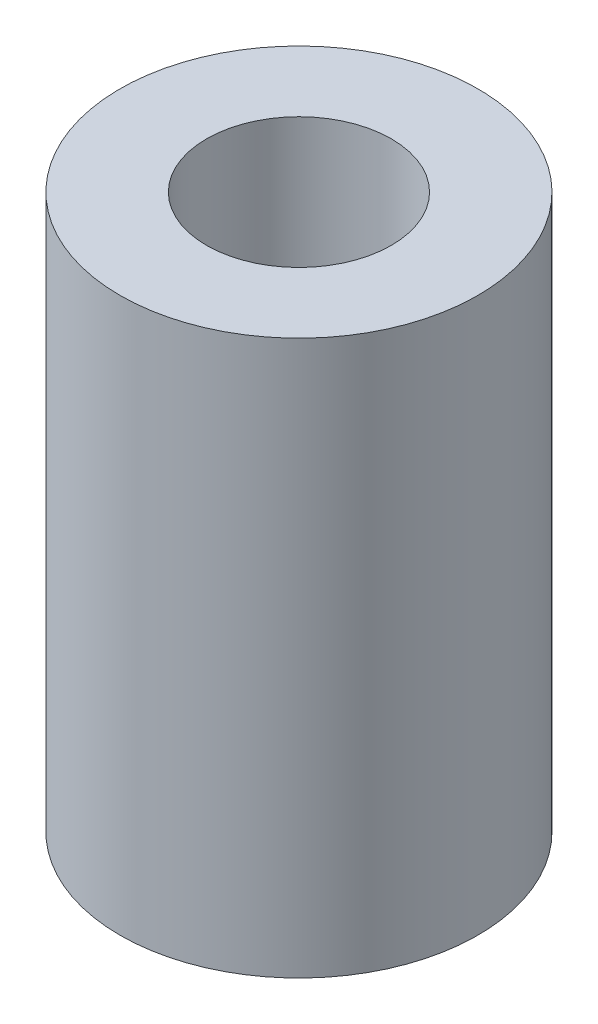
ISO-10303-21;
HEADER;
FILE_DESCRIPTION(('STEP AP214'),'2;1');
FILE_NAME('part.step','',(''),(''),'','','');
FILE_SCHEMA(('AUTOMOTIVE_DESIGN { 1 0 10303 214 1 1 1 1 }'));
ENDSEC;
DATA;
#1=APPLICATION_CONTEXT('core data for automotive mechanical design processes');
#2=APPLICATION_PROTOCOL_DEFINITION('international standard','automotive_design',2000,#1);
#3=PRODUCT_CONTEXT('',#1,'mechanical');
#4=PRODUCT('Part','Part','',(#3));
#5=PRODUCT_RELATED_PRODUCT_CATEGORY('part','',(#4));
#6=PRODUCT_DEFINITION_FORMATION('','',#4);
#7=PRODUCT_DEFINITION_CONTEXT('part definition',#1,'design');
#8=PRODUCT_DEFINITION('design','',#6,#7);
#9=PRODUCT_DEFINITION_SHAPE('','',#8);
#10=(LENGTH_UNIT() NAMED_UNIT(*) SI_UNIT(.MILLI.,.METRE.));
#11=(NAMED_UNIT(*) PLANE_ANGLE_UNIT() SI_UNIT($,.RADIAN.));
#12=(NAMED_UNIT(*) SI_UNIT($,.STERADIAN.) SOLID_ANGLE_UNIT());
#13=UNCERTAINTY_MEASURE_WITH_UNIT(LENGTH_MEASURE(1.E-05),#10,'distance_accuracy_value','');
#14=(GEOMETRIC_REPRESENTATION_CONTEXT(3) GLOBAL_UNCERTAINTY_ASSIGNED_CONTEXT((#13)) GLOBAL_UNIT_ASSIGNED_CONTEXT((#10,
#11,#12)) REPRESENTATION_CONTEXT('',''));
#15=CARTESIAN_POINT('',(0.,0.,0.));
#16=DIRECTION('',(0.,0.,1.));
#17=DIRECTION('',(1.,0.,0.));
#18=AXIS2_PLACEMENT_3D('',#15,#16,#17);
#19=CARTESIAN_POINT('',(0.,24.,0.));
#20=DIRECTION('',(0.,1.,0.));
#21=DIRECTION('',(0.,0.,1.));
#22=AXIS2_PLACEMENT_3D('',#19,#20,#21);
#23=PLANE('',#22);
#24=CARTESIAN_POINT('',(0.,24.,0.));
#25=DIRECTION('',(0.,1.,0.));
#26=DIRECTION('',(0.,0.,1.));
#27=AXIS2_PLACEMENT_3D('',#24,#25,#26);
#28=CIRCLE('',#27,7.75);
#29=CARTESIAN_POINT('',(0.,24.,7.75));
#30=VERTEX_POINT('',#29);
#31=EDGE_CURVE('E10',#30,#30,#28,.T.);
#32=ORIENTED_EDGE('',*,*,#31,.T.);
#33=EDGE_LOOP('',(#32));
#34=FACE_BOUND('',#33,.T.);
#35=CARTESIAN_POINT('',(0.,24.,0.));
#36=DIRECTION('',(0.,1.,0.));
#37=DIRECTION('',(0.,0.,1.));
#38=AXIS2_PLACEMENT_3D('',#35,#36,#37);
#39=CIRCLE('',#38,4.);
#40=CARTESIAN_POINT('',(0.,24.,4.));
#41=VERTEX_POINT('',#40);
#42=EDGE_CURVE('E54',#41,#41,#39,.T.);
#43=ORIENTED_EDGE('',*,*,#42,.F.);
#44=EDGE_LOOP('',(#43));
#45=FACE_BOUND('',#44,.T.);
#46=ADVANCED_FACE('F41',(#34,#45),#23,.T.);
#47=CARTESIAN_POINT('',(0.,0.,0.));
#48=DIRECTION('',(0.,1.,0.));
#49=DIRECTION('',(0.,0.,1.));
#50=AXIS2_PLACEMENT_3D('',#47,#48,#49);
#51=PLANE('',#50);
#52=CARTESIAN_POINT('',(0.,0.,0.));
#53=DIRECTION('',(0.,1.,0.));
#54=DIRECTION('',(0.,0.,1.));
#55=AXIS2_PLACEMENT_3D('',#52,#53,#54);
#56=CIRCLE('',#55,7.75);
#57=CARTESIAN_POINT('',(0.,0.,7.75));
#58=VERTEX_POINT('',#57);
#59=EDGE_CURVE('E45',#58,#58,#56,.T.);
#60=ORIENTED_EDGE('',*,*,#59,.F.);
#61=EDGE_LOOP('',(#60));
#62=FACE_BOUND('',#61,.T.);
#63=CARTESIAN_POINT('',(0.,0.,0.));
#64=DIRECTION('',(0.,1.,0.));
#65=DIRECTION('',(0.,0.,1.));
#66=AXIS2_PLACEMENT_3D('',#63,#64,#65);
#67=CIRCLE('',#66,4.);
#68=CARTESIAN_POINT('',(0.,0.,4.));
#69=VERTEX_POINT('',#68);
#70=EDGE_CURVE('E56',#69,#69,#67,.T.);
#71=ORIENTED_EDGE('',*,*,#70,.T.);
#72=EDGE_LOOP('',(#71));
#73=FACE_BOUND('',#72,.T.);
#74=ADVANCED_FACE('F68',(#62,#73),#51,.F.);
#75=CARTESIAN_POINT('',(0.,24.,0.));
#76=DIRECTION('',(0.,-1.,0.));
#77=DIRECTION('',(0.,0.,-1.));
#78=AXIS2_PLACEMENT_3D('',#75,#76,#77);
#79=CYLINDRICAL_SURFACE('',#78,7.75);
#80=ORIENTED_EDGE('',*,*,#31,.F.);
#81=EDGE_LOOP('',(#80));
#82=FACE_BOUND('',#81,.T.);
#83=ORIENTED_EDGE('',*,*,#59,.T.);
#84=EDGE_LOOP('',(#83));
#85=FACE_BOUND('',#84,.T.);
#86=ADVANCED_FACE('F43',(#82,#85),#79,.T.);
#87=CARTESIAN_POINT('',(0.,24.,0.));
#88=DIRECTION('',(0.,-1.,0.));
#89=DIRECTION('',(0.,0.,-1.));
#90=AXIS2_PLACEMENT_3D('',#87,#88,#89);
#91=CYLINDRICAL_SURFACE('',#90,4.);
#92=ORIENTED_EDGE('',*,*,#42,.T.);
#93=EDGE_LOOP('',(#92));
#94=FACE_BOUND('',#93,.T.);
#95=ORIENTED_EDGE('',*,*,#70,.F.);
#96=EDGE_LOOP('',(#95));
#97=FACE_BOUND('',#96,.T.);
#98=ADVANCED_FACE('F64',(#94,#97),#91,.F.);
#99=CLOSED_SHELL('',(#46,#74,#86,#98));
#100=MANIFOLD_SOLID_BREP('B2',#99);
#101=ADVANCED_BREP_SHAPE_REPRESENTATION('',(#18,#100),#14);
#102=SHAPE_DEFINITION_REPRESENTATION(#9,#101);
ENDSEC;
END-ISO-10303-21;
